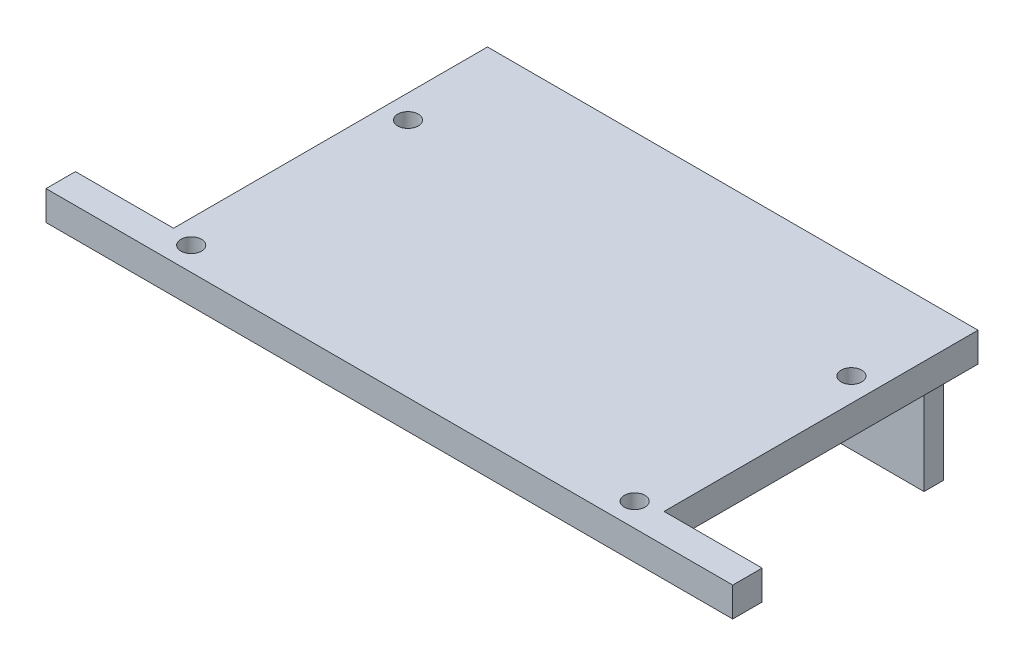
ISO-10303-21;
HEADER;
FILE_DESCRIPTION(('STEP AP214'),'2;1');
FILE_NAME('part.step','',(''),(''),'','','');
FILE_SCHEMA(('AUTOMOTIVE_DESIGN { 1 0 10303 214 1 1 1 1 }'));
ENDSEC;
DATA;
#1=APPLICATION_CONTEXT('core data for automotive mechanical design processes');
#2=APPLICATION_PROTOCOL_DEFINITION('international standard','automotive_design',2000,#1);
#3=PRODUCT_CONTEXT('',#1,'mechanical');
#4=PRODUCT('Part','Part','',(#3));
#5=PRODUCT_RELATED_PRODUCT_CATEGORY('part','',(#4));
#6=PRODUCT_DEFINITION_FORMATION('','',#4);
#7=PRODUCT_DEFINITION_CONTEXT('part definition',#1,'design');
#8=PRODUCT_DEFINITION('design','',#6,#7);
#9=PRODUCT_DEFINITION_SHAPE('','',#8);
#10=(LENGTH_UNIT() NAMED_UNIT(*) SI_UNIT(.MILLI.,.METRE.));
#11=(NAMED_UNIT(*) PLANE_ANGLE_UNIT() SI_UNIT($,.RADIAN.));
#12=(NAMED_UNIT(*) SI_UNIT($,.STERADIAN.) SOLID_ANGLE_UNIT());
#13=UNCERTAINTY_MEASURE_WITH_UNIT(LENGTH_MEASURE(1.E-05),#10,'distance_accuracy_value','');
#14=(GEOMETRIC_REPRESENTATION_CONTEXT(3) GLOBAL_UNCERTAINTY_ASSIGNED_CONTEXT((#13)) GLOBAL_UNIT_ASSIGNED_CONTEXT((#10,
#11,#12)) REPRESENTATION_CONTEXT('',''));
#15=CARTESIAN_POINT('',(0.,0.,0.));
#16=DIRECTION('',(0.,0.,1.));
#17=DIRECTION('',(1.,0.,0.));
#18=AXIS2_PLACEMENT_3D('',#15,#16,#17);
#19=CARTESIAN_POINT('',(0.,0.,0.));
#20=DIRECTION('',(0.,-1.,0.));
#21=DIRECTION('',(0.,0.,-1.));
#22=AXIS2_PLACEMENT_3D('',#19,#20,#21);
#23=PLANE('',#22);
#24=CARTESIAN_POINT('',(21.3611186846836,0.,-7.05852842809364));
#25=DIRECTION('',(0.,1.,0.));
#26=DIRECTION('',(0.,0.,1.));
#27=AXIS2_PLACEMENT_3D('',#24,#25,#26);
#28=CIRCLE('',#27,1.05);
#29=CARTESIAN_POINT('',(21.3611186846836,0.,-6.00852842809364));
#30=VERTEX_POINT('',#29);
#31=EDGE_CURVE('E206',#30,#30,#28,.T.);
#32=ORIENTED_EDGE('',*,*,#31,.T.);
#33=EDGE_LOOP('',(#32));
#34=FACE_BOUND('',#33,.T.);
#35=CARTESIAN_POINT('',(-23.8388813153164,0.,-7.05852842809364));
#36=DIRECTION('',(0.,1.,0.));
#37=DIRECTION('',(0.,0.,1.));
#38=AXIS2_PLACEMENT_3D('',#35,#36,#37);
#39=CIRCLE('',#38,1.05);
#40=CARTESIAN_POINT('',(-23.8388813153164,0.,-6.00852842809365));
#41=VERTEX_POINT('',#40);
#42=EDGE_CURVE('E212',#41,#41,#39,.T.);
#43=ORIENTED_EDGE('',*,*,#42,.T.);
#44=EDGE_LOOP('',(#43));
#45=FACE_BOUND('',#44,.T.);
#46=CARTESIAN_POINT('',(21.3611186846836,0.,15.0414715719064));
#47=DIRECTION('',(0.,1.,0.));
#48=DIRECTION('',(0.,0.,1.));
#49=AXIS2_PLACEMENT_3D('',#46,#47,#48);
#50=CIRCLE('',#49,1.05);
#51=CARTESIAN_POINT('',(21.3611186846836,0.,16.0914715719064));
#52=VERTEX_POINT('',#51);
#53=EDGE_CURVE('E218',#52,#52,#50,.T.);
#54=ORIENTED_EDGE('',*,*,#53,.T.);
#55=EDGE_LOOP('',(#54));
#56=FACE_BOUND('',#55,.T.);
#57=CARTESIAN_POINT('',(-23.8388813153164,0.,15.0414715719064));
#58=DIRECTION('',(0.,1.,0.));
#59=DIRECTION('',(0.,0.,1.));
#60=AXIS2_PLACEMENT_3D('',#57,#58,#59);
#61=CIRCLE('',#60,1.05);
#62=CARTESIAN_POINT('',(-23.8388813153164,0.,16.0914715719064));
#63=VERTEX_POINT('',#62);
#64=EDGE_CURVE('E224',#63,#63,#61,.T.);
#65=ORIENTED_EDGE('',*,*,#64,.T.);
#66=EDGE_LOOP('',(#65));
#67=FACE_BOUND('',#66,.T.);
#68=DIRECTION('',(-1.,0.,0.));
#69=VECTOR('',#68,1.);
#70=CARTESIAN_POINT('',(-26.2388813153164,0.,-17.5585284280936));
#71=LINE('',#70,#69);
#72=CARTESIAN_POINT('',(-22.7388813153164,0.,-17.5585284280936));
#73=VERTEX_POINT('',#72);
#74=CARTESIAN_POINT('',(-26.2388813153164,0.,-17.5585284280936));
#75=VERTEX_POINT('',#74);
#76=EDGE_CURVE('E264',#73,#75,#71,.T.);
#77=ORIENTED_EDGE('',*,*,#76,.F.);
#78=DIRECTION('',(0.,0.,-1.));
#79=VECTOR('',#78,1.);
#80=CARTESIAN_POINT('',(-22.7388813153164,0.,-17.5585284280936));
#81=LINE('',#80,#79);
#82=CARTESIAN_POINT('',(-22.7388813153164,0.,-15.5585284280936));
#83=VERTEX_POINT('',#82);
#84=EDGE_CURVE('E172',#83,#73,#81,.T.);
#85=ORIENTED_EDGE('',*,*,#84,.F.);
#86=DIRECTION('',(-1.,0.,0.));
#87=VECTOR('',#86,1.);
#88=CARTESIAN_POINT('',(-22.7388813153164,0.,-15.5585284280936));
#89=LINE('',#88,#87);
#90=CARTESIAN_POINT('',(-18.7388813153164,0.,-15.5585284280936));
#91=VERTEX_POINT('',#90);
#92=EDGE_CURVE('E168',#91,#83,#89,.T.);
#93=ORIENTED_EDGE('',*,*,#92,.F.);
#94=DIRECTION('',(0.,0.,1.));
#95=VECTOR('',#94,1.);
#96=CARTESIAN_POINT('',(-18.7388813153164,0.,-17.5585284280936));
#97=LINE('',#96,#95);
#98=CARTESIAN_POINT('',(-18.7388813153164,0.,-17.5585284280936));
#99=VERTEX_POINT('',#98);
#100=EDGE_CURVE('E315',#99,#91,#97,.T.);
#101=ORIENTED_EDGE('',*,*,#100,.F.);
#102=CARTESIAN_POINT('',(5.26111868468363,0.,-17.5585284280936));
#103=VERTEX_POINT('',#102);
#104=EDGE_CURVE('E266',#103,#99,#71,.T.);
#105=ORIENTED_EDGE('',*,*,#104,.F.);
#106=DIRECTION('',(0.,0.,-1.));
#107=VECTOR('',#106,1.);
#108=CARTESIAN_POINT('',(5.26111868468363,0.,-17.5585284280936));
#109=LINE('',#108,#107);
#110=CARTESIAN_POINT('',(5.26111868468363,0.,-15.5585284280936));
#111=VERTEX_POINT('',#110);
#112=EDGE_CURVE('E185',#111,#103,#109,.T.);
#113=ORIENTED_EDGE('',*,*,#112,.F.);
#114=DIRECTION('',(-1.,0.,0.));
#115=VECTOR('',#114,1.);
#116=CARTESIAN_POINT('',(20.2611186846836,0.,-15.5585284280936));
#117=LINE('',#116,#115);
#118=CARTESIAN_POINT('',(20.2611186846836,0.,-15.5585284280936));
#119=VERTEX_POINT('',#118);
#120=EDGE_CURVE('E58',#119,#111,#117,.T.);
#121=ORIENTED_EDGE('',*,*,#120,.F.);
#122=DIRECTION('',(0.,0.,1.));
#123=VECTOR('',#122,1.);
#124=CARTESIAN_POINT('',(20.2611186846836,0.,-17.5585284280936));
#125=LINE('',#124,#123);
#126=CARTESIAN_POINT('',(20.2611186846836,0.,-17.5585284280936));
#127=VERTEX_POINT('',#126);
#128=EDGE_CURVE('E174',#127,#119,#125,.T.);
#129=ORIENTED_EDGE('',*,*,#128,.F.);
#130=CARTESIAN_POINT('',(23.7611186846836,0.,-17.5585284280936));
#131=VERTEX_POINT('',#130);
#132=EDGE_CURVE('E234',#131,#127,#71,.T.);
#133=ORIENTED_EDGE('',*,*,#132,.F.);
#134=DIRECTION('',(0.,0.,-1.));
#135=VECTOR('',#134,1.);
#136=CARTESIAN_POINT('',(23.7611186846836,0.,-17.5585284280936));
#137=LINE('',#136,#135);
#138=CARTESIAN_POINT('',(23.7611186846836,0.,14.4414715719064));
#139=VERTEX_POINT('',#138);
#140=EDGE_CURVE('E262',#139,#131,#137,.T.);
#141=ORIENTED_EDGE('',*,*,#140,.F.);
#142=DIRECTION('',(-1.,0.,0.));
#143=VECTOR('',#142,1.);
#144=CARTESIAN_POINT('',(23.7611186846836,0.,14.4414715719064));
#145=LINE('',#144,#143);
#146=CARTESIAN_POINT('',(33.7611186846836,0.,14.4414715719064));
#147=VERTEX_POINT('',#146);
#148=EDGE_CURVE('E260',#147,#139,#145,.T.);
#149=ORIENTED_EDGE('',*,*,#148,.F.);
#150=DIRECTION('',(0.,0.,-1.));
#151=VECTOR('',#150,1.);
#152=CARTESIAN_POINT('',(33.7611186846836,0.,17.4414715719063));
#153=LINE('',#152,#151);
#154=CARTESIAN_POINT('',(33.7611186846836,0.,17.4414715719063));
#155=VERTEX_POINT('',#154);
#156=EDGE_CURVE('E258',#155,#147,#153,.T.);
#157=ORIENTED_EDGE('',*,*,#156,.F.);
#158=DIRECTION('',(1.,0.,0.));
#159=VECTOR('',#158,1.);
#160=CARTESIAN_POINT('',(23.7611186846836,0.,17.4414715719064));
#161=LINE('',#160,#159);
#162=CARTESIAN_POINT('',(-36.2388813153164,0.,17.4414715719064));
#163=VERTEX_POINT('',#162);
#164=EDGE_CURVE('E256',#163,#155,#161,.T.);
#165=ORIENTED_EDGE('',*,*,#164,.F.);
#166=DIRECTION('',(0.,0.,1.));
#167=VECTOR('',#166,1.);
#168=CARTESIAN_POINT('',(-36.2388813153164,0.,17.4414715719064));
#169=LINE('',#168,#167);
#170=CARTESIAN_POINT('',(-36.2388813153164,0.,14.4414715719064));
#171=VERTEX_POINT('',#170);
#172=EDGE_CURVE('E253',#171,#163,#169,.T.);
#173=ORIENTED_EDGE('',*,*,#172,.F.);
#174=DIRECTION('',(-1.,0.,0.));
#175=VECTOR('',#174,1.);
#176=CARTESIAN_POINT('',(-26.2388813153164,0.,14.4414715719064));
#177=LINE('',#176,#175);
#178=CARTESIAN_POINT('',(-26.2388813153164,0.,14.4414715719064));
#179=VERTEX_POINT('',#178);
#180=EDGE_CURVE('E251',#179,#171,#177,.T.);
#181=ORIENTED_EDGE('',*,*,#180,.F.);
#182=DIRECTION('',(0.,0.,1.));
#183=VECTOR('',#182,1.);
#184=CARTESIAN_POINT('',(-26.2388813153164,0.,-17.5585284280936));
#185=LINE('',#184,#183);
#186=EDGE_CURVE('E227',#75,#179,#185,.T.);
#187=ORIENTED_EDGE('',*,*,#186,.F.);
#188=EDGE_LOOP('',(#77,#85,#93,#101,#105,#113,#121,#129,#133,#141,#149,#157,#165,#173,#181,#187));
#189=FACE_BOUND('',#188,.T.);
#190=ADVANCED_FACE('F35',(#34,#45,#56,#67,#189),#23,.T.);
#191=CARTESIAN_POINT('',(-26.2388813153164,3.,-17.5585284280936));
#192=DIRECTION('',(1.,0.,0.));
#193=DIRECTION('',(0.,0.,-1.));
#194=AXIS2_PLACEMENT_3D('',#191,#192,#193);
#195=PLANE('',#194);
#196=ORIENTED_EDGE('',*,*,#186,.T.);
#197=DIRECTION('',(0.,-1.,0.));
#198=VECTOR('',#197,1.);
#199=CARTESIAN_POINT('',(-26.2388813153164,3.,14.4414715719064));
#200=LINE('',#199,#198);
#201=CARTESIAN_POINT('',(-26.2388813153164,3.,14.4414715719064));
#202=VERTEX_POINT('',#201);
#203=EDGE_CURVE('E11',#202,#179,#200,.T.);
#204=ORIENTED_EDGE('',*,*,#203,.F.);
#205=DIRECTION('',(0.,0.,1.));
#206=VECTOR('',#205,1.);
#207=CARTESIAN_POINT('',(-26.2388813153164,3.,-17.5585284280936));
#208=LINE('',#207,#206);
#209=CARTESIAN_POINT('',(-26.2388813153164,3.,-17.5585284280936));
#210=VERTEX_POINT('',#209);
#211=EDGE_CURVE('E230',#210,#202,#208,.T.);
#212=ORIENTED_EDGE('',*,*,#211,.F.);
#213=DIRECTION('',(0.,-1.,0.));
#214=VECTOR('',#213,1.);
#215=CARTESIAN_POINT('',(-26.2388813153164,3.,-17.5585284280936));
#216=LINE('',#215,#214);
#217=EDGE_CURVE('E248',#210,#75,#216,.T.);
#218=ORIENTED_EDGE('',*,*,#217,.T.);
#219=EDGE_LOOP('',(#196,#204,#212,#218));
#220=FACE_BOUND('',#219,.T.);
#221=ADVANCED_FACE('F37',(#220),#195,.F.);
#222=CARTESIAN_POINT('',(-26.2388813153164,3.,14.4414715719064));
#223=DIRECTION('',(0.,0.,1.));
#224=DIRECTION('',(1.,0.,0.));
#225=AXIS2_PLACEMENT_3D('',#222,#223,#224);
#226=PLANE('',#225);
#227=ORIENTED_EDGE('',*,*,#180,.T.);
#228=DIRECTION('',(0.,-1.,0.));
#229=VECTOR('',#228,1.);
#230=CARTESIAN_POINT('',(-36.2388813153164,3.,14.4414715719064));
#231=LINE('',#230,#229);
#232=CARTESIAN_POINT('',(-36.2388813153164,3.,14.4414715719064));
#233=VERTEX_POINT('',#232);
#234=EDGE_CURVE('E43',#233,#171,#231,.T.);
#235=ORIENTED_EDGE('',*,*,#234,.F.);
#236=DIRECTION('',(-1.,0.,0.));
#237=VECTOR('',#236,1.);
#238=CARTESIAN_POINT('',(-26.2388813153164,3.,14.4414715719064));
#239=LINE('',#238,#237);
#240=EDGE_CURVE('E233',#202,#233,#239,.T.);
#241=ORIENTED_EDGE('',*,*,#240,.F.);
#242=ORIENTED_EDGE('',*,*,#203,.T.);
#243=EDGE_LOOP('',(#227,#235,#241,#242));
#244=FACE_BOUND('',#243,.T.);
#245=ADVANCED_FACE('F308',(#244),#226,.F.);
#246=CARTESIAN_POINT('',(-36.2388813153164,3.,17.4414715719064));
#247=DIRECTION('',(1.,0.,0.));
#248=DIRECTION('',(0.,0.,-1.));
#249=AXIS2_PLACEMENT_3D('',#246,#247,#248);
#250=PLANE('',#249);
#251=ORIENTED_EDGE('',*,*,#172,.T.);
#252=DIRECTION('',(0.,-1.,0.));
#253=VECTOR('',#252,1.);
#254=CARTESIAN_POINT('',(-36.2388813153164,3.,17.4414715719064));
#255=LINE('',#254,#253);
#256=CARTESIAN_POINT('',(-36.2388813153164,3.,17.4414715719064));
#257=VERTEX_POINT('',#256);
#258=EDGE_CURVE('E281',#257,#163,#255,.T.);
#259=ORIENTED_EDGE('',*,*,#258,.F.);
#260=DIRECTION('',(0.,0.,1.));
#261=VECTOR('',#260,1.);
#262=CARTESIAN_POINT('',(-36.2388813153164,3.,17.4414715719064));
#263=LINE('',#262,#261);
#264=EDGE_CURVE('E236',#233,#257,#263,.T.);
#265=ORIENTED_EDGE('',*,*,#264,.F.);
#266=ORIENTED_EDGE('',*,*,#234,.T.);
#267=EDGE_LOOP('',(#251,#259,#265,#266));
#268=FACE_BOUND('',#267,.T.);
#269=ADVANCED_FACE('F288',(#268),#250,.F.);
#270=CARTESIAN_POINT('',(23.7611186846836,3.,17.4414715719064));
#271=DIRECTION('',(0.,0.,-1.));
#272=DIRECTION('',(-1.,0.,0.));
#273=AXIS2_PLACEMENT_3D('',#270,#271,#272);
#274=PLANE('',#273);
#275=ORIENTED_EDGE('',*,*,#164,.T.);
#276=DIRECTION('',(0.,-1.,0.));
#277=VECTOR('',#276,1.);
#278=CARTESIAN_POINT('',(33.7611186846836,3.,17.4414715719063));
#279=LINE('',#278,#277);
#280=CARTESIAN_POINT('',(33.7611186846836,3.,17.4414715719063));
#281=VERTEX_POINT('',#280);
#282=EDGE_CURVE('E278',#281,#155,#279,.T.);
#283=ORIENTED_EDGE('',*,*,#282,.F.);
#284=DIRECTION('',(1.,0.,0.));
#285=VECTOR('',#284,1.);
#286=CARTESIAN_POINT('',(-26.2388813153164,3.,17.4414715719064));
#287=LINE('',#286,#285);
#288=EDGE_CURVE('E238',#257,#281,#287,.T.);
#289=ORIENTED_EDGE('',*,*,#288,.F.);
#290=ORIENTED_EDGE('',*,*,#258,.T.);
#291=EDGE_LOOP('',(#275,#283,#289,#290));
#292=FACE_BOUND('',#291,.T.);
#293=ADVANCED_FACE('F296',(#292),#274,.F.);
#294=CARTESIAN_POINT('',(33.7611186846836,3.,17.4414715719063));
#295=DIRECTION('',(-1.,0.,0.));
#296=DIRECTION('',(0.,0.,1.));
#297=AXIS2_PLACEMENT_3D('',#294,#295,#296);
#298=PLANE('',#297);
#299=ORIENTED_EDGE('',*,*,#156,.T.);
#300=DIRECTION('',(0.,-1.,0.));
#301=VECTOR('',#300,1.);
#302=CARTESIAN_POINT('',(33.7611186846836,3.,14.4414715719064));
#303=LINE('',#302,#301);
#304=CARTESIAN_POINT('',(33.7611186846836,3.,14.4414715719064));
#305=VERTEX_POINT('',#304);
#306=EDGE_CURVE('E275',#305,#147,#303,.T.);
#307=ORIENTED_EDGE('',*,*,#306,.F.);
#308=DIRECTION('',(0.,0.,-1.));
#309=VECTOR('',#308,1.);
#310=CARTESIAN_POINT('',(33.7611186846836,3.,17.4414715719063));
#311=LINE('',#310,#309);
#312=EDGE_CURVE('E240',#281,#305,#311,.T.);
#313=ORIENTED_EDGE('',*,*,#312,.F.);
#314=ORIENTED_EDGE('',*,*,#282,.T.);
#315=EDGE_LOOP('',(#299,#307,#313,#314));
#316=FACE_BOUND('',#315,.T.);
#317=ADVANCED_FACE('F300',(#316),#298,.F.);
#318=CARTESIAN_POINT('',(23.7611186846836,3.,14.4414715719064));
#319=DIRECTION('',(0.,0.,1.));
#320=DIRECTION('',(1.,0.,0.));
#321=AXIS2_PLACEMENT_3D('',#318,#319,#320);
#322=PLANE('',#321);
#323=ORIENTED_EDGE('',*,*,#148,.T.);
#324=DIRECTION('',(0.,-1.,0.));
#325=VECTOR('',#324,1.);
#326=CARTESIAN_POINT('',(23.7611186846836,3.,14.4414715719064));
#327=LINE('',#326,#325);
#328=CARTESIAN_POINT('',(23.7611186846836,3.,14.4414715719064));
#329=VERTEX_POINT('',#328);
#330=EDGE_CURVE('E272',#329,#139,#327,.T.);
#331=ORIENTED_EDGE('',*,*,#330,.F.);
#332=DIRECTION('',(-1.,0.,0.));
#333=VECTOR('',#332,1.);
#334=CARTESIAN_POINT('',(23.7611186846836,3.,14.4414715719064));
#335=LINE('',#334,#333);
#336=EDGE_CURVE('E242',#305,#329,#335,.T.);
#337=ORIENTED_EDGE('',*,*,#336,.F.);
#338=ORIENTED_EDGE('',*,*,#306,.T.);
#339=EDGE_LOOP('',(#323,#331,#337,#338));
#340=FACE_BOUND('',#339,.T.);
#341=ADVANCED_FACE('F335',(#340),#322,.F.);
#342=CARTESIAN_POINT('',(23.7611186846836,3.,-17.5585284280936));
#343=DIRECTION('',(-1.,0.,0.));
#344=DIRECTION('',(0.,0.,1.));
#345=AXIS2_PLACEMENT_3D('',#342,#343,#344);
#346=PLANE('',#345);
#347=ORIENTED_EDGE('',*,*,#140,.T.);
#348=DIRECTION('',(0.,-1.,0.));
#349=VECTOR('',#348,1.);
#350=CARTESIAN_POINT('',(23.7611186846836,3.,-17.5585284280936));
#351=LINE('',#350,#349);
#352=CARTESIAN_POINT('',(23.7611186846836,3.,-17.5585284280936));
#353=VERTEX_POINT('',#352);
#354=EDGE_CURVE('E269',#353,#131,#351,.T.);
#355=ORIENTED_EDGE('',*,*,#354,.F.);
#356=DIRECTION('',(0.,0.,-1.));
#357=VECTOR('',#356,1.);
#358=CARTESIAN_POINT('',(23.7611186846836,3.,-17.5585284280936));
#359=LINE('',#358,#357);
#360=EDGE_CURVE('E244',#329,#353,#359,.T.);
#361=ORIENTED_EDGE('',*,*,#360,.F.);
#362=ORIENTED_EDGE('',*,*,#330,.T.);
#363=EDGE_LOOP('',(#347,#355,#361,#362));
#364=FACE_BOUND('',#363,.T.);
#365=ADVANCED_FACE('F333',(#364),#346,.F.);
#366=CARTESIAN_POINT('',(-26.2388813153164,3.,-17.5585284280936));
#367=DIRECTION('',(0.,0.,1.));
#368=DIRECTION('',(1.,0.,0.));
#369=AXIS2_PLACEMENT_3D('',#366,#367,#368);
#370=PLANE('',#369);
#371=ORIENTED_EDGE('',*,*,#132,.T.);
#372=DIRECTION('',(0.,1.,0.));
#373=VECTOR('',#372,1.);
#374=CARTESIAN_POINT('',(20.2611186846836,-12.,-17.5585284280936));
#375=LINE('',#374,#373);
#376=CARTESIAN_POINT('',(20.2611186846836,-12.,-17.5585284280936));
#377=VERTEX_POINT('',#376);
#378=EDGE_CURVE('E190',#377,#127,#375,.T.);
#379=ORIENTED_EDGE('',*,*,#378,.F.);
#380=DIRECTION('',(1.,0.,0.));
#381=VECTOR('',#380,1.);
#382=CARTESIAN_POINT('',(20.2611186846836,-12.,-17.5585284280936));
#383=LINE('',#382,#381);
#384=CARTESIAN_POINT('',(5.26111868468363,-12.,-17.5585284280936));
#385=VERTEX_POINT('',#384);
#386=EDGE_CURVE('E189',#385,#377,#383,.T.);
#387=ORIENTED_EDGE('',*,*,#386,.F.);
#388=DIRECTION('',(0.,1.,0.));
#389=VECTOR('',#388,1.);
#390=CARTESIAN_POINT('',(5.26111868468363,-12.,-17.5585284280936));
#391=LINE('',#390,#389);
#392=EDGE_CURVE('E197',#385,#103,#391,.T.);
#393=ORIENTED_EDGE('',*,*,#392,.T.);
#394=ORIENTED_EDGE('',*,*,#104,.T.);
#395=DIRECTION('',(0.,1.,0.));
#396=VECTOR('',#395,1.);
#397=CARTESIAN_POINT('',(-18.7388813153164,-12.,-17.5585284280936));
#398=LINE('',#397,#396);
#399=CARTESIAN_POINT('',(-18.7388813153164,-12.,-17.5585284280936));
#400=VERTEX_POINT('',#399);
#401=EDGE_CURVE('E156',#400,#99,#398,.T.);
#402=ORIENTED_EDGE('',*,*,#401,.F.);
#403=DIRECTION('',(1.,0.,0.));
#404=VECTOR('',#403,1.);
#405=CARTESIAN_POINT('',(-22.7388813153164,-12.,-17.5585284280936));
#406=LINE('',#405,#404);
#407=CARTESIAN_POINT('',(-22.7388813153164,-12.,-17.5585284280936));
#408=VERTEX_POINT('',#407);
#409=EDGE_CURVE('E148',#408,#400,#406,.T.);
#410=ORIENTED_EDGE('',*,*,#409,.F.);
#411=DIRECTION('',(0.,1.,0.));
#412=VECTOR('',#411,1.);
#413=CARTESIAN_POINT('',(-22.7388813153164,-12.,-17.5585284280936));
#414=LINE('',#413,#412);
#415=EDGE_CURVE('E153',#408,#73,#414,.T.);
#416=ORIENTED_EDGE('',*,*,#415,.T.);
#417=ORIENTED_EDGE('',*,*,#76,.T.);
#418=ORIENTED_EDGE('',*,*,#217,.F.);
#419=DIRECTION('',(-1.,0.,0.));
#420=VECTOR('',#419,1.);
#421=CARTESIAN_POINT('',(-26.2388813153164,3.,-17.5585284280936));
#422=LINE('',#421,#420);
#423=EDGE_CURVE('E246',#353,#210,#422,.T.);
#424=ORIENTED_EDGE('',*,*,#423,.F.);
#425=ORIENTED_EDGE('',*,*,#354,.T.);
#426=EDGE_LOOP('',(#371,#379,#387,#393,#394,#402,#410,#416,#417,#418,#424,#425));
#427=FACE_BOUND('',#426,.T.);
#428=ADVANCED_FACE('F151',(#427),#370,.F.);
#429=CARTESIAN_POINT('',(0.,3.,0.));
#430=DIRECTION('',(0.,-1.,0.));
#431=DIRECTION('',(0.,0.,-1.));
#432=AXIS2_PLACEMENT_3D('',#429,#430,#431);
#433=PLANE('',#432);
#434=CARTESIAN_POINT('',(21.3611186846836,3.,-7.05852842809364));
#435=DIRECTION('',(0.,1.,0.));
#436=DIRECTION('',(0.,0.,1.));
#437=AXIS2_PLACEMENT_3D('',#434,#435,#436);
#438=CIRCLE('',#437,1.05);
#439=CARTESIAN_POINT('',(21.3611186846836,3.,-6.00852842809364));
#440=VERTEX_POINT('',#439);
#441=EDGE_CURVE('E205',#440,#440,#438,.T.);
#442=ORIENTED_EDGE('',*,*,#441,.F.);
#443=EDGE_LOOP('',(#442));
#444=FACE_BOUND('',#443,.T.);
#445=CARTESIAN_POINT('',(-23.8388813153164,3.,-7.05852842809364));
#446=DIRECTION('',(0.,1.,0.));
#447=DIRECTION('',(0.,0.,1.));
#448=AXIS2_PLACEMENT_3D('',#445,#446,#447);
#449=CIRCLE('',#448,1.05);
#450=CARTESIAN_POINT('',(-23.8388813153164,3.,-6.00852842809365));
#451=VERTEX_POINT('',#450);
#452=EDGE_CURVE('E209',#451,#451,#449,.T.);
#453=ORIENTED_EDGE('',*,*,#452,.F.);
#454=EDGE_LOOP('',(#453));
#455=FACE_BOUND('',#454,.T.);
#456=CARTESIAN_POINT('',(21.3611186846836,3.,15.0414715719064));
#457=DIRECTION('',(0.,1.,0.));
#458=DIRECTION('',(0.,0.,1.));
#459=AXIS2_PLACEMENT_3D('',#456,#457,#458);
#460=CIRCLE('',#459,1.05);
#461=CARTESIAN_POINT('',(21.3611186846836,3.,16.0914715719064));
#462=VERTEX_POINT('',#461);
#463=EDGE_CURVE('E215',#462,#462,#460,.T.);
#464=ORIENTED_EDGE('',*,*,#463,.F.);
#465=EDGE_LOOP('',(#464));
#466=FACE_BOUND('',#465,.T.);
#467=CARTESIAN_POINT('',(-23.8388813153164,3.,15.0414715719064));
#468=DIRECTION('',(0.,1.,0.));
#469=DIRECTION('',(0.,0.,1.));
#470=AXIS2_PLACEMENT_3D('',#467,#468,#469);
#471=CIRCLE('',#470,1.05);
#472=CARTESIAN_POINT('',(-23.8388813153164,3.,16.0914715719064));
#473=VERTEX_POINT('',#472);
#474=EDGE_CURVE('E221',#473,#473,#471,.T.);
#475=ORIENTED_EDGE('',*,*,#474,.F.);
#476=EDGE_LOOP('',(#475));
#477=FACE_BOUND('',#476,.T.);
#478=ORIENTED_EDGE('',*,*,#211,.T.);
#479=ORIENTED_EDGE('',*,*,#240,.T.);
#480=ORIENTED_EDGE('',*,*,#264,.T.);
#481=ORIENTED_EDGE('',*,*,#288,.T.);
#482=ORIENTED_EDGE('',*,*,#312,.T.);
#483=ORIENTED_EDGE('',*,*,#336,.T.);
#484=ORIENTED_EDGE('',*,*,#360,.T.);
#485=ORIENTED_EDGE('',*,*,#423,.T.);
#486=EDGE_LOOP('',(#478,#479,#480,#481,#482,#483,#484,#485));
#487=FACE_BOUND('',#486,.T.);
#488=ADVANCED_FACE('F304',(#444,#455,#466,#477,#487),#433,.F.);
#489=CARTESIAN_POINT('',(-23.8388813153164,0.,15.0414715719064));
#490=DIRECTION('',(0.,1.,0.));
#491=DIRECTION('',(0.,0.,1.));
#492=AXIS2_PLACEMENT_3D('',#489,#490,#491);
#493=CYLINDRICAL_SURFACE('',#492,1.05);
#494=ORIENTED_EDGE('',*,*,#64,.F.);
#495=EDGE_LOOP('',(#494));
#496=FACE_BOUND('',#495,.T.);
#497=ORIENTED_EDGE('',*,*,#474,.T.);
#498=EDGE_LOOP('',(#497));
#499=FACE_BOUND('',#498,.T.);
#500=ADVANCED_FACE('F358',(#496,#499),#493,.F.);
#501=CARTESIAN_POINT('',(21.3611186846836,0.,15.0414715719064));
#502=DIRECTION('',(0.,1.,0.));
#503=DIRECTION('',(0.,0.,1.));
#504=AXIS2_PLACEMENT_3D('',#501,#502,#503);
#505=CYLINDRICAL_SURFACE('',#504,1.05);
#506=ORIENTED_EDGE('',*,*,#53,.F.);
#507=EDGE_LOOP('',(#506));
#508=FACE_BOUND('',#507,.T.);
#509=ORIENTED_EDGE('',*,*,#463,.T.);
#510=EDGE_LOOP('',(#509));
#511=FACE_BOUND('',#510,.T.);
#512=ADVANCED_FACE('F363',(#508,#511),#505,.F.);
#513=CARTESIAN_POINT('',(-23.8388813153164,0.,-7.05852842809364));
#514=DIRECTION('',(0.,1.,0.));
#515=DIRECTION('',(0.,0.,1.));
#516=AXIS2_PLACEMENT_3D('',#513,#514,#515);
#517=CYLINDRICAL_SURFACE('',#516,1.05);
#518=ORIENTED_EDGE('',*,*,#42,.F.);
#519=EDGE_LOOP('',(#518));
#520=FACE_BOUND('',#519,.T.);
#521=ORIENTED_EDGE('',*,*,#452,.T.);
#522=EDGE_LOOP('',(#521));
#523=FACE_BOUND('',#522,.T.);
#524=ADVANCED_FACE('F375',(#520,#523),#517,.F.);
#525=CARTESIAN_POINT('',(21.3611186846836,0.,-7.05852842809364));
#526=DIRECTION('',(0.,1.,0.));
#527=DIRECTION('',(0.,0.,1.));
#528=AXIS2_PLACEMENT_3D('',#525,#526,#527);
#529=CYLINDRICAL_SURFACE('',#528,1.05);
#530=ORIENTED_EDGE('',*,*,#31,.F.);
#531=EDGE_LOOP('',(#530));
#532=FACE_BOUND('',#531,.T.);
#533=ORIENTED_EDGE('',*,*,#441,.T.);
#534=EDGE_LOOP('',(#533));
#535=FACE_BOUND('',#534,.T.);
#536=ADVANCED_FACE('F381',(#532,#535),#529,.F.);
#537=CARTESIAN_POINT('',(20.2611186846836,-12.,-17.5585284280936));
#538=DIRECTION('',(-1.,0.,0.));
#539=DIRECTION('',(0.,0.,1.));
#540=AXIS2_PLACEMENT_3D('',#537,#538,#539);
#541=PLANE('',#540);
#542=ORIENTED_EDGE('',*,*,#128,.T.);
#543=DIRECTION('',(0.,1.,0.));
#544=VECTOR('',#543,1.);
#545=CARTESIAN_POINT('',(20.2611186846836,-12.,-15.5585284280936));
#546=LINE('',#545,#544);
#547=CARTESIAN_POINT('',(20.2611186846836,-12.,-15.5585284280936));
#548=VERTEX_POINT('',#547);
#549=EDGE_CURVE('E203',#548,#119,#546,.T.);
#550=ORIENTED_EDGE('',*,*,#549,.F.);
#551=DIRECTION('',(0.,0.,1.));
#552=VECTOR('',#551,1.);
#553=CARTESIAN_POINT('',(20.2611186846836,-12.,-17.5585284280936));
#554=LINE('',#553,#552);
#555=EDGE_CURVE('E181',#377,#548,#554,.T.);
#556=ORIENTED_EDGE('',*,*,#555,.F.);
#557=ORIENTED_EDGE('',*,*,#378,.T.);
#558=EDGE_LOOP('',(#542,#550,#556,#557));
#559=FACE_BOUND('',#558,.T.);
#560=ADVANCED_FACE('F325',(#559),#541,.F.);
#561=CARTESIAN_POINT('',(20.2611186846836,-12.,-15.5585284280936));
#562=DIRECTION('',(0.,0.,-1.));
#563=DIRECTION('',(-1.,0.,0.));
#564=AXIS2_PLACEMENT_3D('',#561,#562,#563);
#565=PLANE('',#564);
#566=ORIENTED_EDGE('',*,*,#120,.T.);
#567=DIRECTION('',(0.,1.,0.));
#568=VECTOR('',#567,1.);
#569=CARTESIAN_POINT('',(5.26111868468363,-12.,-15.5585284280936));
#570=LINE('',#569,#568);
#571=CARTESIAN_POINT('',(5.26111868468363,-12.,-15.5585284280936));
#572=VERTEX_POINT('',#571);
#573=EDGE_CURVE('E200',#572,#111,#570,.T.);
#574=ORIENTED_EDGE('',*,*,#573,.F.);
#575=DIRECTION('',(-1.,0.,0.));
#576=VECTOR('',#575,1.);
#577=CARTESIAN_POINT('',(20.2611186846836,-12.,-15.5585284280936));
#578=LINE('',#577,#576);
#579=EDGE_CURVE('E184',#548,#572,#578,.T.);
#580=ORIENTED_EDGE('',*,*,#579,.F.);
#581=ORIENTED_EDGE('',*,*,#549,.T.);
#582=EDGE_LOOP('',(#566,#574,#580,#581));
#583=FACE_BOUND('',#582,.T.);
#584=ADVANCED_FACE('F321',(#583),#565,.F.);
#585=CARTESIAN_POINT('',(5.26111868468363,-12.,-17.5585284280936));
#586=DIRECTION('',(1.,0.,0.));
#587=DIRECTION('',(0.,0.,-1.));
#588=AXIS2_PLACEMENT_3D('',#585,#586,#587);
#589=PLANE('',#588);
#590=ORIENTED_EDGE('',*,*,#112,.T.);
#591=ORIENTED_EDGE('',*,*,#392,.F.);
#592=DIRECTION('',(0.,0.,-1.));
#593=VECTOR('',#592,1.);
#594=CARTESIAN_POINT('',(5.26111868468363,-12.,-17.5585284280936));
#595=LINE('',#594,#593);
#596=EDGE_CURVE('E187',#572,#385,#595,.T.);
#597=ORIENTED_EDGE('',*,*,#596,.F.);
#598=ORIENTED_EDGE('',*,*,#573,.T.);
#599=EDGE_LOOP('',(#590,#591,#597,#598));
#600=FACE_BOUND('',#599,.T.);
#601=ADVANCED_FACE('F317',(#600),#589,.F.);
#602=CARTESIAN_POINT('',(0.,-12.,0.));
#603=DIRECTION('',(0.,-1.,0.));
#604=DIRECTION('',(0.,0.,-1.));
#605=AXIS2_PLACEMENT_3D('',#602,#603,#604);
#606=PLANE('',#605);
#607=ORIENTED_EDGE('',*,*,#555,.T.);
#608=ORIENTED_EDGE('',*,*,#579,.T.);
#609=ORIENTED_EDGE('',*,*,#596,.T.);
#610=ORIENTED_EDGE('',*,*,#386,.T.);
#611=EDGE_LOOP('',(#607,#608,#609,#610));
#612=FACE_BOUND('',#611,.T.);
#613=ADVANCED_FACE('F395',(#612),#606,.T.);
#614=CARTESIAN_POINT('',(-22.7388813153164,-12.,-17.5585284280936));
#615=DIRECTION('',(1.,0.,0.));
#616=DIRECTION('',(0.,0.,-1.));
#617=AXIS2_PLACEMENT_3D('',#614,#615,#616);
#618=PLANE('',#617);
#619=ORIENTED_EDGE('',*,*,#84,.T.);
#620=ORIENTED_EDGE('',*,*,#415,.F.);
#621=DIRECTION('',(0.,0.,-1.));
#622=VECTOR('',#621,1.);
#623=CARTESIAN_POINT('',(-22.7388813153164,-12.,-17.5585284280936));
#624=LINE('',#623,#622);
#625=CARTESIAN_POINT('',(-22.7388813153164,-12.,-15.5585284280936));
#626=VERTEX_POINT('',#625);
#627=EDGE_CURVE('E160',#626,#408,#624,.T.);
#628=ORIENTED_EDGE('',*,*,#627,.F.);
#629=DIRECTION('',(0.,1.,0.));
#630=VECTOR('',#629,1.);
#631=CARTESIAN_POINT('',(-22.7388813153164,-12.,-15.5585284280936));
#632=LINE('',#631,#630);
#633=EDGE_CURVE('E548',#626,#83,#632,.T.);
#634=ORIENTED_EDGE('',*,*,#633,.T.);
#635=EDGE_LOOP('',(#619,#620,#628,#634));
#636=FACE_BOUND('',#635,.T.);
#637=ADVANCED_FACE('F170',(#636),#618,.F.);
#638=CARTESIAN_POINT('',(-18.7388813153164,-12.,-17.5585284280936));
#639=DIRECTION('',(-1.,0.,0.));
#640=DIRECTION('',(0.,0.,1.));
#641=AXIS2_PLACEMENT_3D('',#638,#639,#640);
#642=PLANE('',#641);
#643=ORIENTED_EDGE('',*,*,#100,.T.);
#644=DIRECTION('',(0.,1.,0.));
#645=VECTOR('',#644,1.);
#646=CARTESIAN_POINT('',(-18.7388813153164,-12.,-15.5585284280936));
#647=LINE('',#646,#645);
#648=CARTESIAN_POINT('',(-18.7388813153164,-12.,-15.5585284280936));
#649=VERTEX_POINT('',#648);
#650=EDGE_CURVE('E50',#649,#91,#647,.T.);
#651=ORIENTED_EDGE('',*,*,#650,.F.);
#652=DIRECTION('',(0.,0.,1.));
#653=VECTOR('',#652,1.);
#654=CARTESIAN_POINT('',(-18.7388813153164,-12.,-17.5585284280936));
#655=LINE('',#654,#653);
#656=EDGE_CURVE('E159',#400,#649,#655,.T.);
#657=ORIENTED_EDGE('',*,*,#656,.F.);
#658=ORIENTED_EDGE('',*,*,#401,.T.);
#659=EDGE_LOOP('',(#643,#651,#657,#658));
#660=FACE_BOUND('',#659,.T.);
#661=ADVANCED_FACE('F401',(#660),#642,.F.);
#662=CARTESIAN_POINT('',(-22.7388813153164,-12.,-15.5585284280936));
#663=DIRECTION('',(0.,0.,-1.));
#664=DIRECTION('',(-1.,0.,0.));
#665=AXIS2_PLACEMENT_3D('',#662,#663,#664);
#666=PLANE('',#665);
#667=ORIENTED_EDGE('',*,*,#92,.T.);
#668=ORIENTED_EDGE('',*,*,#633,.F.);
#669=DIRECTION('',(-1.,0.,0.));
#670=VECTOR('',#669,1.);
#671=CARTESIAN_POINT('',(-22.7388813153164,-12.,-15.5585284280936));
#672=LINE('',#671,#670);
#673=EDGE_CURVE('E164',#649,#626,#672,.T.);
#674=ORIENTED_EDGE('',*,*,#673,.F.);
#675=ORIENTED_EDGE('',*,*,#650,.T.);
#676=EDGE_LOOP('',(#667,#668,#674,#675));
#677=FACE_BOUND('',#676,.T.);
#678=ADVANCED_FACE('F404',(#677),#666,.F.);
#679=CARTESIAN_POINT('',(0.,-12.,0.));
#680=DIRECTION('',(0.,1.,0.));
#681=DIRECTION('',(0.,0.,1.));
#682=AXIS2_PLACEMENT_3D('',#679,#680,#681);
#683=PLANE('',#682);
#684=ORIENTED_EDGE('',*,*,#627,.T.);
#685=ORIENTED_EDGE('',*,*,#409,.T.);
#686=ORIENTED_EDGE('',*,*,#656,.T.);
#687=ORIENTED_EDGE('',*,*,#673,.T.);
#688=EDGE_LOOP('',(#684,#685,#686,#687));
#689=FACE_BOUND('',#688,.T.);
#690=ADVANCED_FACE('F163',(#689),#683,.F.);
#691=CLOSED_SHELL('',(#190,#221,#245,#269,#293,#317,#341,#365,#428,#488,#500,#512,#524,#536,
#560,#584,#601,#613,#637,#661,#678,#690));
#692=MANIFOLD_SOLID_BREP('B2',#691);
#693=ADVANCED_BREP_SHAPE_REPRESENTATION('',(#18,#692),#14);
#694=SHAPE_DEFINITION_REPRESENTATION(#9,#693);
ENDSEC;
END-ISO-10303-21;
